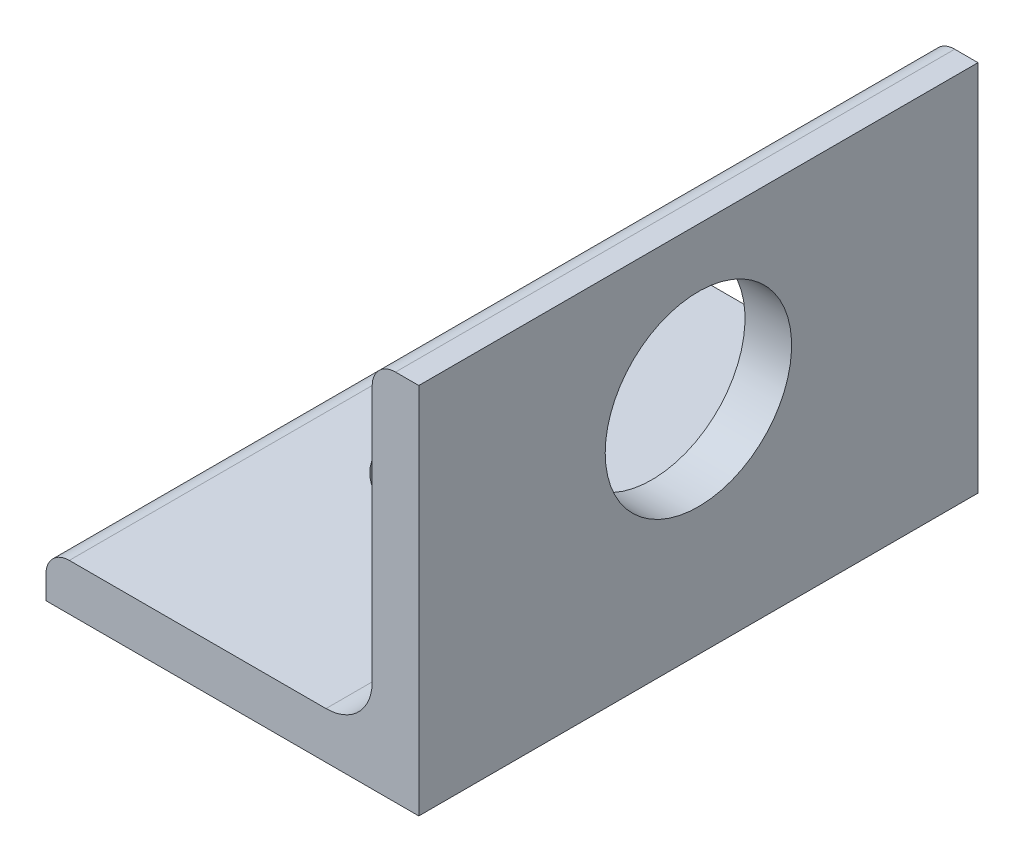
ISO-10303-21;
HEADER;
FILE_DESCRIPTION(('STEP AP214'),'2;1');
FILE_NAME('part.step','',(''),(''),'','','');
FILE_SCHEMA(('AUTOMOTIVE_DESIGN { 1 0 10303 214 1 1 1 1 }'));
ENDSEC;
DATA;
#1=APPLICATION_CONTEXT('core data for automotive mechanical design processes');
#2=APPLICATION_PROTOCOL_DEFINITION('international standard','automotive_design',2000,#1);
#3=PRODUCT_CONTEXT('',#1,'mechanical');
#4=PRODUCT('Part','Part','',(#3));
#5=PRODUCT_RELATED_PRODUCT_CATEGORY('part','',(#4));
#6=PRODUCT_DEFINITION_FORMATION('','',#4);
#7=PRODUCT_DEFINITION_CONTEXT('part definition',#1,'design');
#8=PRODUCT_DEFINITION('design','',#6,#7);
#9=PRODUCT_DEFINITION_SHAPE('','',#8);
#10=(LENGTH_UNIT() NAMED_UNIT(*) SI_UNIT(.MILLI.,.METRE.));
#11=(NAMED_UNIT(*) PLANE_ANGLE_UNIT() SI_UNIT($,.RADIAN.));
#12=(NAMED_UNIT(*) SI_UNIT($,.STERADIAN.) SOLID_ANGLE_UNIT());
#13=UNCERTAINTY_MEASURE_WITH_UNIT(LENGTH_MEASURE(1.E-05),#10,'distance_accuracy_value','');
#14=(GEOMETRIC_REPRESENTATION_CONTEXT(3) GLOBAL_UNCERTAINTY_ASSIGNED_CONTEXT((#13)) GLOBAL_UNIT_ASSIGNED_CONTEXT((#10,
#11,#12)) REPRESENTATION_CONTEXT('',''));
#15=CARTESIAN_POINT('',(0.,0.,0.));
#16=DIRECTION('',(0.,0.,1.));
#17=DIRECTION('',(1.,0.,0.));
#18=AXIS2_PLACEMENT_3D('',#15,#16,#17);
#19=CARTESIAN_POINT('',(-6.35,0.79375,9.525));
#20=DIRECTION('',(1.,0.,0.));
#21=DIRECTION('',(0.,0.,-1.));
#22=AXIS2_PLACEMENT_3D('',#19,#20,#21);
#23=PLANE('',#22);
#24=DIRECTION('',(0.,-1.,0.));
#25=VECTOR('',#24,1.);
#26=CARTESIAN_POINT('',(-6.35,0.79375,-9.525));
#27=LINE('',#26,#25);
#28=CARTESIAN_POINT('',(-6.35,0.79375,-9.525));
#29=VERTEX_POINT('',#28);
#30=CARTESIAN_POINT('',(-6.35,0.,-9.525));
#31=VERTEX_POINT('',#30);
#32=EDGE_CURVE('E145',#29,#31,#27,.T.);
#33=ORIENTED_EDGE('',*,*,#32,.T.);
#34=DIRECTION('',(0.,0.,-1.));
#35=VECTOR('',#34,1.);
#36=CARTESIAN_POINT('',(-6.35,0.,9.525));
#37=LINE('',#36,#35);
#38=CARTESIAN_POINT('',(-6.35,0.,9.525));
#39=VERTEX_POINT('',#38);
#40=EDGE_CURVE('E11',#39,#31,#37,.T.);
#41=ORIENTED_EDGE('',*,*,#40,.F.);
#42=DIRECTION('',(0.,-1.,0.));
#43=VECTOR('',#42,1.);
#44=CARTESIAN_POINT('',(-6.35,0.79375,9.525));
#45=LINE('',#44,#43);
#46=CARTESIAN_POINT('',(-6.35,0.79375,9.525));
#47=VERTEX_POINT('',#46);
#48=EDGE_CURVE('E171',#47,#39,#45,.T.);
#49=ORIENTED_EDGE('',*,*,#48,.F.);
#50=DIRECTION('',(0.,0.,-1.));
#51=VECTOR('',#50,1.);
#52=CARTESIAN_POINT('',(-6.35,0.79375,9.525));
#53=LINE('',#52,#51);
#54=EDGE_CURVE('E141',#47,#29,#53,.T.);
#55=ORIENTED_EDGE('',*,*,#54,.T.);
#56=EDGE_LOOP('',(#33,#41,#49,#55));
#57=FACE_BOUND('',#56,.T.);
#58=ADVANCED_FACE('F38',(#57),#23,.F.);
#59=CARTESIAN_POINT('',(-6.35,0.,9.525));
#60=DIRECTION('',(0.,1.,0.));
#61=DIRECTION('',(0.,0.,1.));
#62=AXIS2_PLACEMENT_3D('',#59,#60,#61);
#63=PLANE('',#62);
#64=CARTESIAN_POINT('',(-1.184275,0.,0.));
#65=DIRECTION('',(0.,1.,0.));
#66=DIRECTION('',(0.,0.,1.));
#67=AXIS2_PLACEMENT_3D('',#64,#65,#66);
#68=CIRCLE('',#67,2.59079999999998);
#69=CARTESIAN_POINT('',(-1.184275,0.,2.59079999999998));
#70=VERTEX_POINT('',#69);
#71=EDGE_CURVE('E150',#70,#70,#68,.T.);
#72=ORIENTED_EDGE('',*,*,#71,.T.);
#73=EDGE_LOOP('',(#72));
#74=FACE_BOUND('',#73,.T.);
#75=DIRECTION('',(1.,0.,0.));
#76=VECTOR('',#75,1.);
#77=CARTESIAN_POINT('',(-6.35,0.,-9.525));
#78=LINE('',#77,#76);
#79=CARTESIAN_POINT('',(6.35,0.,-9.525));
#80=VERTEX_POINT('',#79);
#81=EDGE_CURVE('E149',#31,#80,#78,.T.);
#82=ORIENTED_EDGE('',*,*,#81,.T.);
#83=DIRECTION('',(0.,0.,-1.));
#84=VECTOR('',#83,1.);
#85=CARTESIAN_POINT('',(6.35,0.,9.525));
#86=LINE('',#85,#84);
#87=CARTESIAN_POINT('',(6.35,0.,9.525));
#88=VERTEX_POINT('',#87);
#89=EDGE_CURVE('E47',#88,#80,#86,.T.);
#90=ORIENTED_EDGE('',*,*,#89,.F.);
#91=DIRECTION('',(1.,0.,0.));
#92=VECTOR('',#91,1.);
#93=CARTESIAN_POINT('',(-6.35,0.,9.525));
#94=LINE('',#93,#92);
#95=EDGE_CURVE('E101',#39,#88,#94,.T.);
#96=ORIENTED_EDGE('',*,*,#95,.F.);
#97=ORIENTED_EDGE('',*,*,#40,.T.);
#98=EDGE_LOOP('',(#82,#90,#96,#97));
#99=FACE_BOUND('',#98,.T.);
#100=ADVANCED_FACE('F263',(#74,#99),#63,.F.);
#101=CARTESIAN_POINT('',(6.35,0.,9.525));
#102=DIRECTION('',(-1.,0.,0.));
#103=DIRECTION('',(0.,0.,1.));
#104=AXIS2_PLACEMENT_3D('',#101,#102,#103);
#105=PLANE('',#104);
#106=CARTESIAN_POINT('',(6.35,7.534275,0.));
#107=DIRECTION('',(-1.,0.,0.));
#108=DIRECTION('',(0.,0.,1.));
#109=AXIS2_PLACEMENT_3D('',#106,#107,#108);
#110=CIRCLE('',#109,3.175);
#111=CARTESIAN_POINT('',(6.35,7.534275,3.175));
#112=VERTEX_POINT('',#111);
#113=EDGE_CURVE('E232',#112,#112,#110,.T.);
#114=ORIENTED_EDGE('',*,*,#113,.T.);
#115=EDGE_LOOP('',(#114));
#116=FACE_BOUND('',#115,.T.);
#117=DIRECTION('',(0.,1.,0.));
#118=VECTOR('',#117,1.);
#119=CARTESIAN_POINT('',(6.35,0.,-9.525));
#120=LINE('',#119,#118);
#121=CARTESIAN_POINT('',(6.35,12.7,-9.525));
#122=VERTEX_POINT('',#121);
#123=EDGE_CURVE('E153',#80,#122,#120,.T.);
#124=ORIENTED_EDGE('',*,*,#123,.T.);
#125=DIRECTION('',(0.,0.,-1.));
#126=VECTOR('',#125,1.);
#127=CARTESIAN_POINT('',(6.35,12.7,9.525));
#128=LINE('',#127,#126);
#129=CARTESIAN_POINT('',(6.35,12.7,9.525));
#130=VERTEX_POINT('',#129);
#131=EDGE_CURVE('E186',#130,#122,#128,.T.);
#132=ORIENTED_EDGE('',*,*,#131,.F.);
#133=DIRECTION('',(0.,1.,0.));
#134=VECTOR('',#133,1.);
#135=CARTESIAN_POINT('',(6.35,0.,9.525));
#136=LINE('',#135,#134);
#137=EDGE_CURVE('E196',#88,#130,#136,.T.);
#138=ORIENTED_EDGE('',*,*,#137,.F.);
#139=ORIENTED_EDGE('',*,*,#89,.T.);
#140=EDGE_LOOP('',(#124,#132,#138,#139));
#141=FACE_BOUND('',#140,.T.);
#142=ADVANCED_FACE('F194',(#116,#141),#105,.F.);
#143=CARTESIAN_POINT('',(5.55625,12.7,9.525));
#144=DIRECTION('',(0.,-1.,0.));
#145=DIRECTION('',(0.,0.,-1.));
#146=AXIS2_PLACEMENT_3D('',#143,#144,#145);
#147=PLANE('',#146);
#148=DIRECTION('',(-1.,0.,0.));
#149=VECTOR('',#148,1.);
#150=CARTESIAN_POINT('',(5.55625,12.7,-9.525));
#151=LINE('',#150,#149);
#152=CARTESIAN_POINT('',(5.55625,12.7,-9.525));
#153=VERTEX_POINT('',#152);
#154=EDGE_CURVE('E156',#122,#153,#151,.T.);
#155=ORIENTED_EDGE('',*,*,#154,.T.);
#156=DIRECTION('',(0.,0.,-1.));
#157=VECTOR('',#156,1.);
#158=CARTESIAN_POINT('',(5.55625,12.7,9.525));
#159=LINE('',#158,#157);
#160=CARTESIAN_POINT('',(5.55625,12.7,9.525));
#161=VERTEX_POINT('',#160);
#162=EDGE_CURVE('E182',#161,#153,#159,.T.);
#163=ORIENTED_EDGE('',*,*,#162,.F.);
#164=DIRECTION('',(-1.,0.,0.));
#165=VECTOR('',#164,1.);
#166=CARTESIAN_POINT('',(5.55625,12.7,9.525));
#167=LINE('',#166,#165);
#168=EDGE_CURVE('E213',#130,#161,#167,.T.);
#169=ORIENTED_EDGE('',*,*,#168,.F.);
#170=ORIENTED_EDGE('',*,*,#131,.T.);
#171=EDGE_LOOP('',(#155,#163,#169,#170));
#172=FACE_BOUND('',#171,.T.);
#173=ADVANCED_FACE('F205',(#172),#147,.F.);
#174=CARTESIAN_POINT('',(5.55625,11.90625,9.525));
#175=DIRECTION('',(0.,0.,-1.));
#176=DIRECTION('',(-1.,0.,0.));
#177=AXIS2_PLACEMENT_3D('',#174,#175,#176);
#178=CYLINDRICAL_SURFACE('',#177,0.793749999999999);
#179=CARTESIAN_POINT('',(5.55625,11.90625,-9.525));
#180=DIRECTION('',(0.,0.,1.));
#181=DIRECTION('',(-1.,0.,0.));
#182=AXIS2_PLACEMENT_3D('',#179,#180,#181);
#183=CIRCLE('',#182,0.793749999999999);
#184=CARTESIAN_POINT('',(4.7625,11.90625,-9.525));
#185=VERTEX_POINT('',#184);
#186=EDGE_CURVE('E159',#153,#185,#183,.T.);
#187=ORIENTED_EDGE('',*,*,#186,.T.);
#188=DIRECTION('',(0.,0.,-1.));
#189=VECTOR('',#188,1.);
#190=CARTESIAN_POINT('',(4.7625,11.90625,9.525));
#191=LINE('',#190,#189);
#192=CARTESIAN_POINT('',(4.7625,11.90625,9.525));
#193=VERTEX_POINT('',#192);
#194=EDGE_CURVE('E178',#193,#185,#191,.T.);
#195=ORIENTED_EDGE('',*,*,#194,.F.);
#196=CARTESIAN_POINT('',(5.55625,11.90625,9.525));
#197=DIRECTION('',(0.,0.,1.));
#198=DIRECTION('',(-1.,0.,0.));
#199=AXIS2_PLACEMENT_3D('',#196,#197,#198);
#200=CIRCLE('',#199,0.793749999999999);
#201=EDGE_CURVE('E211',#161,#193,#200,.T.);
#202=ORIENTED_EDGE('',*,*,#201,.F.);
#203=ORIENTED_EDGE('',*,*,#162,.T.);
#204=EDGE_LOOP('',(#187,#195,#202,#203));
#205=FACE_BOUND('',#204,.T.);
#206=ADVANCED_FACE('F209',(#205),#178,.T.);
#207=CARTESIAN_POINT('',(4.7625,11.90625,9.525));
#208=DIRECTION('',(1.,0.,0.));
#209=DIRECTION('',(0.,1.,0.));
#210=AXIS2_PLACEMENT_3D('',#207,#208,#209);
#211=PLANE('',#210);
#212=CARTESIAN_POINT('',(4.7625,7.534275,0.));
#213=DIRECTION('',(-1.,0.,0.));
#214=DIRECTION('',(0.,0.,1.));
#215=AXIS2_PLACEMENT_3D('',#212,#213,#214);
#216=CIRCLE('',#215,3.175);
#217=CARTESIAN_POINT('',(4.7625,7.534275,3.175));
#218=VERTEX_POINT('',#217);
#219=EDGE_CURVE('E236',#218,#218,#216,.T.);
#220=ORIENTED_EDGE('',*,*,#219,.F.);
#221=EDGE_LOOP('',(#220));
#222=FACE_BOUND('',#221,.T.);
#223=DIRECTION('',(0.,-1.,0.));
#224=VECTOR('',#223,1.);
#225=CARTESIAN_POINT('',(4.7625,11.90625,-9.525));
#226=LINE('',#225,#224);
#227=CARTESIAN_POINT('',(4.7625,3.1623,-9.525));
#228=VERTEX_POINT('',#227);
#229=EDGE_CURVE('E162',#185,#228,#226,.T.);
#230=ORIENTED_EDGE('',*,*,#229,.T.);
#231=DIRECTION('',(0.,0.,-1.));
#232=VECTOR('',#231,1.);
#233=CARTESIAN_POINT('',(4.7625,3.1623,9.525));
#234=LINE('',#233,#232);
#235=CARTESIAN_POINT('',(4.7625,3.1623,9.525));
#236=VERTEX_POINT('',#235);
#237=EDGE_CURVE('E134',#236,#228,#234,.T.);
#238=ORIENTED_EDGE('',*,*,#237,.F.);
#239=DIRECTION('',(0.,-1.,0.));
#240=VECTOR('',#239,1.);
#241=CARTESIAN_POINT('',(4.7625,11.90625,9.525));
#242=LINE('',#241,#240);
#243=EDGE_CURVE('E123',#193,#236,#242,.T.);
#244=ORIENTED_EDGE('',*,*,#243,.F.);
#245=ORIENTED_EDGE('',*,*,#194,.T.);
#246=EDGE_LOOP('',(#230,#238,#244,#245));
#247=FACE_BOUND('',#246,.T.);
#248=ADVANCED_FACE('F243',(#222,#247),#211,.F.);
#249=CARTESIAN_POINT('',(3.1877,3.1623,9.525));
#250=DIRECTION('',(0.,0.,-1.));
#251=DIRECTION('',(-1.,0.,0.));
#252=AXIS2_PLACEMENT_3D('',#249,#250,#251);
#253=CYLINDRICAL_SURFACE('',#252,1.5748);
#254=CARTESIAN_POINT('',(3.1877,3.1623,-9.525));
#255=DIRECTION('',(0.,0.,-1.));
#256=DIRECTION('',(-1.,0.,0.));
#257=AXIS2_PLACEMENT_3D('',#254,#255,#256);
#258=CIRCLE('',#257,1.5748);
#259=CARTESIAN_POINT('',(3.1877,1.5875,-9.525));
#260=VERTEX_POINT('',#259);
#261=EDGE_CURVE('E132',#228,#260,#258,.T.);
#262=ORIENTED_EDGE('',*,*,#261,.T.);
#263=DIRECTION('',(0.,0.,-1.));
#264=VECTOR('',#263,1.);
#265=CARTESIAN_POINT('',(3.1877,1.5875,9.525));
#266=LINE('',#265,#264);
#267=CARTESIAN_POINT('',(3.1877,1.5875,9.525));
#268=VERTEX_POINT('',#267);
#269=EDGE_CURVE('E129',#268,#260,#266,.T.);
#270=ORIENTED_EDGE('',*,*,#269,.F.);
#271=CARTESIAN_POINT('',(3.1877,3.1623,9.525));
#272=DIRECTION('',(0.,0.,-1.));
#273=DIRECTION('',(-1.,0.,0.));
#274=AXIS2_PLACEMENT_3D('',#271,#272,#273);
#275=CIRCLE('',#274,1.5748);
#276=EDGE_CURVE('E117',#236,#268,#275,.T.);
#277=ORIENTED_EDGE('',*,*,#276,.F.);
#278=ORIENTED_EDGE('',*,*,#237,.T.);
#279=EDGE_LOOP('',(#262,#270,#277,#278));
#280=FACE_BOUND('',#279,.T.);
#281=ADVANCED_FACE('F130',(#280),#253,.F.);
#282=CARTESIAN_POINT('',(3.1877,1.5875,9.525));
#283=DIRECTION('',(0.,-1.,0.));
#284=DIRECTION('',(1.,0.,0.));
#285=AXIS2_PLACEMENT_3D('',#282,#283,#284);
#286=PLANE('',#285);
#287=CARTESIAN_POINT('',(-1.184275,1.5875,0.));
#288=DIRECTION('',(0.,1.,0.));
#289=DIRECTION('',(0.,0.,1.));
#290=AXIS2_PLACEMENT_3D('',#287,#288,#289);
#291=CIRCLE('',#290,2.59079999999999);
#292=CARTESIAN_POINT('',(-1.184275,1.5875,2.59079999999999));
#293=VERTEX_POINT('',#292);
#294=EDGE_CURVE('E228',#293,#293,#291,.T.);
#295=ORIENTED_EDGE('',*,*,#294,.F.);
#296=EDGE_LOOP('',(#295));
#297=FACE_BOUND('',#296,.T.);
#298=DIRECTION('',(-1.,0.,0.));
#299=VECTOR('',#298,1.);
#300=CARTESIAN_POINT('',(3.1877,1.5875,-9.525));
#301=LINE('',#300,#299);
#302=CARTESIAN_POINT('',(-5.55625,1.5875,-9.525));
#303=VERTEX_POINT('',#302);
#304=EDGE_CURVE('E87',#260,#303,#301,.T.);
#305=ORIENTED_EDGE('',*,*,#304,.T.);
#306=DIRECTION('',(0.,0.,-1.));
#307=VECTOR('',#306,1.);
#308=CARTESIAN_POINT('',(-5.55625,1.5875,9.525));
#309=LINE('',#308,#307);
#310=CARTESIAN_POINT('',(-5.55625,1.5875,9.525));
#311=VERTEX_POINT('',#310);
#312=EDGE_CURVE('E135',#311,#303,#309,.T.);
#313=ORIENTED_EDGE('',*,*,#312,.F.);
#314=DIRECTION('',(-1.,0.,0.));
#315=VECTOR('',#314,1.);
#316=CARTESIAN_POINT('',(3.1877,1.5875,9.525));
#317=LINE('',#316,#315);
#318=EDGE_CURVE('E121',#268,#311,#317,.T.);
#319=ORIENTED_EDGE('',*,*,#318,.F.);
#320=ORIENTED_EDGE('',*,*,#269,.T.);
#321=EDGE_LOOP('',(#305,#313,#319,#320));
#322=FACE_BOUND('',#321,.T.);
#323=ADVANCED_FACE('F137',(#297,#322),#286,.F.);
#324=CARTESIAN_POINT('',(-5.55625,0.79375,9.525));
#325=DIRECTION('',(0.,0.,-1.));
#326=DIRECTION('',(-1.,0.,0.));
#327=AXIS2_PLACEMENT_3D('',#324,#325,#326);
#328=CYLINDRICAL_SURFACE('',#327,0.793749999999999);
#329=CARTESIAN_POINT('',(-5.55625,0.79375,-9.525));
#330=DIRECTION('',(0.,0.,1.));
#331=DIRECTION('',(-1.,0.,0.));
#332=AXIS2_PLACEMENT_3D('',#329,#330,#331);
#333=CIRCLE('',#332,0.793749999999999);
#334=EDGE_CURVE('E93',#303,#29,#333,.T.);
#335=ORIENTED_EDGE('',*,*,#334,.T.);
#336=ORIENTED_EDGE('',*,*,#54,.F.);
#337=CARTESIAN_POINT('',(-5.55625,0.79375,9.525));
#338=DIRECTION('',(0.,0.,1.));
#339=DIRECTION('',(-1.,0.,0.));
#340=AXIS2_PLACEMENT_3D('',#337,#338,#339);
#341=CIRCLE('',#340,0.793749999999999);
#342=EDGE_CURVE('E55',#311,#47,#341,.T.);
#343=ORIENTED_EDGE('',*,*,#342,.F.);
#344=ORIENTED_EDGE('',*,*,#312,.T.);
#345=EDGE_LOOP('',(#335,#336,#343,#344));
#346=FACE_BOUND('',#345,.T.);
#347=ADVANCED_FACE('F250',(#346),#328,.T.);
#348=CARTESIAN_POINT('',(5.55625,11.90625,9.525));
#349=DIRECTION('',(0.,0.,-1.));
#350=DIRECTION('',(-1.,0.,0.));
#351=AXIS2_PLACEMENT_3D('',#348,#349,#350);
#352=PLANE('',#351);
#353=ORIENTED_EDGE('',*,*,#48,.T.);
#354=ORIENTED_EDGE('',*,*,#95,.T.);
#355=ORIENTED_EDGE('',*,*,#137,.T.);
#356=ORIENTED_EDGE('',*,*,#168,.T.);
#357=ORIENTED_EDGE('',*,*,#201,.T.);
#358=ORIENTED_EDGE('',*,*,#243,.T.);
#359=ORIENTED_EDGE('',*,*,#276,.T.);
#360=ORIENTED_EDGE('',*,*,#318,.T.);
#361=ORIENTED_EDGE('',*,*,#342,.T.);
#362=EDGE_LOOP('',(#353,#354,#355,#356,#357,#358,#359,#360,#361));
#363=FACE_BOUND('',#362,.T.);
#364=ADVANCED_FACE('F119',(#363),#352,.F.);
#365=CARTESIAN_POINT('',(5.55625,11.90625,-9.525));
#366=DIRECTION('',(0.,0.,-1.));
#367=DIRECTION('',(-1.,0.,0.));
#368=AXIS2_PLACEMENT_3D('',#365,#366,#367);
#369=PLANE('',#368);
#370=ORIENTED_EDGE('',*,*,#32,.F.);
#371=ORIENTED_EDGE('',*,*,#334,.F.);
#372=ORIENTED_EDGE('',*,*,#304,.F.);
#373=ORIENTED_EDGE('',*,*,#261,.F.);
#374=ORIENTED_EDGE('',*,*,#229,.F.);
#375=ORIENTED_EDGE('',*,*,#186,.F.);
#376=ORIENTED_EDGE('',*,*,#154,.F.);
#377=ORIENTED_EDGE('',*,*,#123,.F.);
#378=ORIENTED_EDGE('',*,*,#81,.F.);
#379=EDGE_LOOP('',(#370,#371,#372,#373,#374,#375,#376,#377,#378));
#380=FACE_BOUND('',#379,.T.);
#381=ADVANCED_FACE('F200',(#380),#369,.T.);
#382=CARTESIAN_POINT('',(-1.184275,1.5875,0.));
#383=DIRECTION('',(0.,1.,0.));
#384=DIRECTION('',(0.,0.,1.));
#385=AXIS2_PLACEMENT_3D('',#382,#383,#384);
#386=CYLINDRICAL_SURFACE('',#385,2.59079999999999);
#387=ORIENTED_EDGE('',*,*,#71,.F.);
#388=EDGE_LOOP('',(#387));
#389=FACE_BOUND('',#388,.T.);
#390=ORIENTED_EDGE('',*,*,#294,.T.);
#391=EDGE_LOOP('',(#390));
#392=FACE_BOUND('',#391,.T.);
#393=ADVANCED_FACE('F295',(#389,#392),#386,.F.);
#394=CARTESIAN_POINT('',(4.7625,7.534275,0.));
#395=DIRECTION('',(-1.,0.,0.));
#396=DIRECTION('',(0.,0.,1.));
#397=AXIS2_PLACEMENT_3D('',#394,#395,#396);
#398=CYLINDRICAL_SURFACE('',#397,3.175);
#399=ORIENTED_EDGE('',*,*,#113,.F.);
#400=EDGE_LOOP('',(#399));
#401=FACE_BOUND('',#400,.T.);
#402=ORIENTED_EDGE('',*,*,#219,.T.);
#403=EDGE_LOOP('',(#402));
#404=FACE_BOUND('',#403,.T.);
#405=ADVANCED_FACE('F241',(#401,#404),#398,.F.);
#406=CLOSED_SHELL('',(#58,#100,#142,#173,#206,#248,#281,#323,#347,#364,#381,#393,#405));
#407=MANIFOLD_SOLID_BREP('B2',#406);
#408=ADVANCED_BREP_SHAPE_REPRESENTATION('',(#18,#407),#14);
#409=SHAPE_DEFINITION_REPRESENTATION(#9,#408);
ENDSEC;
END-ISO-10303-21;
